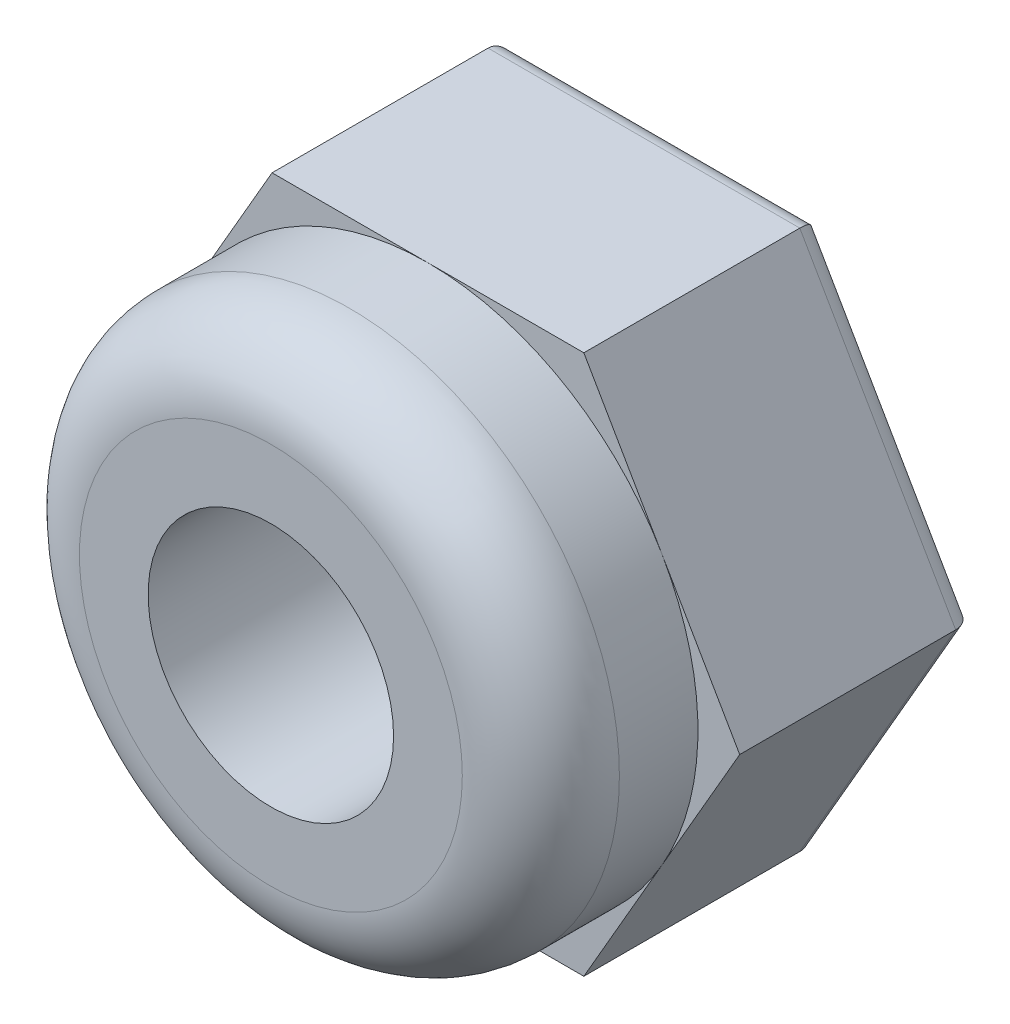
ISO-10303-21;
HEADER;
FILE_DESCRIPTION(('STEP AP214'),'2;1');
FILE_NAME('part.step','',(''),(''),'','','');
FILE_SCHEMA(('AUTOMOTIVE_DESIGN { 1 0 10303 214 1 1 1 1 }'));
ENDSEC;
DATA;
#1=APPLICATION_CONTEXT('core data for automotive mechanical design processes');
#2=APPLICATION_PROTOCOL_DEFINITION('international standard','automotive_design',2000,#1);
#3=PRODUCT_CONTEXT('',#1,'mechanical');
#4=PRODUCT('Part','Part','',(#3));
#5=PRODUCT_RELATED_PRODUCT_CATEGORY('part','',(#4));
#6=PRODUCT_DEFINITION_FORMATION('','',#4);
#7=PRODUCT_DEFINITION_CONTEXT('part definition',#1,'design');
#8=PRODUCT_DEFINITION('design','',#6,#7);
#9=PRODUCT_DEFINITION_SHAPE('','',#8);
#10=(LENGTH_UNIT() NAMED_UNIT(*) SI_UNIT(.MILLI.,.METRE.));
#11=(NAMED_UNIT(*) PLANE_ANGLE_UNIT() SI_UNIT($,.RADIAN.));
#12=(NAMED_UNIT(*) SI_UNIT($,.STERADIAN.) SOLID_ANGLE_UNIT());
#13=UNCERTAINTY_MEASURE_WITH_UNIT(LENGTH_MEASURE(1.E-05),#10,'distance_accuracy_value','');
#14=(GEOMETRIC_REPRESENTATION_CONTEXT(3) GLOBAL_UNCERTAINTY_ASSIGNED_CONTEXT((#13)) GLOBAL_UNIT_ASSIGNED_CONTEXT((#10,
#11,#12)) REPRESENTATION_CONTEXT('',''));
#15=CARTESIAN_POINT('',(0.,0.,0.));
#16=DIRECTION('',(0.,0.,1.));
#17=DIRECTION('',(1.,0.,0.));
#18=AXIS2_PLACEMENT_3D('',#15,#16,#17);
#19=CARTESIAN_POINT('',(0.,0.,2.4));
#20=DIRECTION('',(0.,0.,1.));
#21=DIRECTION('',(1.,0.,0.));
#22=AXIS2_PLACEMENT_3D('',#19,#20,#21);
#23=PLANE('',#22);
#24=CARTESIAN_POINT('',(0.,0.,2.4));
#25=DIRECTION('',(0.,0.,1.));
#26=DIRECTION('',(1.,0.,0.));
#27=AXIS2_PLACEMENT_3D('',#24,#25,#26);
#28=CIRCLE('',#27,2.75);
#29=CARTESIAN_POINT('',(2.38156986040721,1.375,2.4));
#30=VERTEX_POINT('',#29);
#31=CARTESIAN_POINT('',(0.,2.75,2.4));
#32=VERTEX_POINT('',#31);
#33=EDGE_CURVE('E184',#30,#32,#28,.T.);
#34=ORIENTED_EDGE('',*,*,#33,.F.);
#35=DIRECTION('',(-0.5,0.866025403784438,0.));
#36=VECTOR('',#35,1.);
#37=CARTESIAN_POINT('',(3.17542648054294,0.,2.4));
#38=LINE('',#37,#36);
#39=CARTESIAN_POINT('',(1.58771324027147,2.75,2.4));
#40=VERTEX_POINT('',#39);
#41=EDGE_CURVE('E170',#30,#40,#38,.T.);
#42=ORIENTED_EDGE('',*,*,#41,.T.);
#43=DIRECTION('',(-1.,0.,0.));
#44=VECTOR('',#43,1.);
#45=CARTESIAN_POINT('',(1.58771324027147,2.75,2.4));
#46=LINE('',#45,#44);
#47=EDGE_CURVE('E185',#40,#32,#46,.T.);
#48=ORIENTED_EDGE('',*,*,#47,.T.);
#49=EDGE_LOOP('',(#34,#42,#48));
#50=FACE_BOUND('',#49,.T.);
#51=ADVANCED_FACE('F42',(#50),#23,.T.);
#52=CARTESIAN_POINT('',(-2.38156986040721,1.375,2.4));
#53=VERTEX_POINT('',#52);
#54=EDGE_CURVE('E191',#32,#53,#28,.T.);
#55=ORIENTED_EDGE('',*,*,#54,.F.);
#56=CARTESIAN_POINT('',(-1.58771324027147,2.75,2.4));
#57=VERTEX_POINT('',#56);
#58=EDGE_CURVE('E169',#32,#57,#46,.T.);
#59=ORIENTED_EDGE('',*,*,#58,.T.);
#60=DIRECTION('',(-0.499999999999999,-0.866025403784439,0.));
#61=VECTOR('',#60,1.);
#62=CARTESIAN_POINT('',(-1.58771324027147,2.75,2.4));
#63=LINE('',#62,#61);
#64=EDGE_CURVE('E212',#57,#53,#63,.T.);
#65=ORIENTED_EDGE('',*,*,#64,.T.);
#66=EDGE_LOOP('',(#55,#59,#65));
#67=FACE_BOUND('',#66,.T.);
#68=ADVANCED_FACE('F322',(#67),#23,.T.);
#69=CARTESIAN_POINT('',(-2.38156986040721,-1.375,2.4));
#70=VERTEX_POINT('',#69);
#71=EDGE_CURVE('E353',#53,#70,#28,.T.);
#72=ORIENTED_EDGE('',*,*,#71,.F.);
#73=CARTESIAN_POINT('',(-3.17542648054294,0.,2.4));
#74=VERTEX_POINT('',#73);
#75=EDGE_CURVE('E211',#53,#74,#63,.T.);
#76=ORIENTED_EDGE('',*,*,#75,.T.);
#77=DIRECTION('',(0.5,-0.866025403784438,0.));
#78=VECTOR('',#77,1.);
#79=CARTESIAN_POINT('',(-3.17542648054294,0.,2.4));
#80=LINE('',#79,#78);
#81=EDGE_CURVE('E217',#74,#70,#80,.T.);
#82=ORIENTED_EDGE('',*,*,#81,.T.);
#83=EDGE_LOOP('',(#72,#76,#82));
#84=FACE_BOUND('',#83,.T.);
#85=ADVANCED_FACE('F327',(#84),#23,.T.);
#86=CARTESIAN_POINT('',(0.,-2.75,2.4));
#87=VERTEX_POINT('',#86);
#88=EDGE_CURVE('E201',#70,#87,#28,.T.);
#89=ORIENTED_EDGE('',*,*,#88,.F.);
#90=CARTESIAN_POINT('',(-1.58771324027147,-2.75,2.4));
#91=VERTEX_POINT('',#90);
#92=EDGE_CURVE('E216',#70,#91,#80,.T.);
#93=ORIENTED_EDGE('',*,*,#92,.T.);
#94=DIRECTION('',(1.,0.,0.));
#95=VECTOR('',#94,1.);
#96=CARTESIAN_POINT('',(-1.58771324027147,-2.75,2.4));
#97=LINE('',#96,#95);
#98=EDGE_CURVE('E222',#91,#87,#97,.T.);
#99=ORIENTED_EDGE('',*,*,#98,.T.);
#100=EDGE_LOOP('',(#89,#93,#99));
#101=FACE_BOUND('',#100,.T.);
#102=ADVANCED_FACE('F340',(#101),#23,.T.);
#103=CARTESIAN_POINT('',(2.38156986040721,-1.375,2.4));
#104=VERTEX_POINT('',#103);
#105=EDGE_CURVE('E195',#87,#104,#28,.T.);
#106=ORIENTED_EDGE('',*,*,#105,.F.);
#107=CARTESIAN_POINT('',(1.58771324027147,-2.75,2.4));
#108=VERTEX_POINT('',#107);
#109=EDGE_CURVE('E221',#87,#108,#97,.T.);
#110=ORIENTED_EDGE('',*,*,#109,.T.);
#111=DIRECTION('',(0.499999999999999,0.866025403784439,0.));
#112=VECTOR('',#111,1.);
#113=CARTESIAN_POINT('',(1.58771324027147,-2.75,2.4));
#114=LINE('',#113,#112);
#115=EDGE_CURVE('E182',#108,#104,#114,.T.);
#116=ORIENTED_EDGE('',*,*,#115,.T.);
#117=EDGE_LOOP('',(#106,#110,#116));
#118=FACE_BOUND('',#117,.T.);
#119=ADVANCED_FACE('F333',(#118),#23,.T.);
#120=EDGE_CURVE('E162',#104,#30,#28,.T.);
#121=ORIENTED_EDGE('',*,*,#120,.F.);
#122=CARTESIAN_POINT('',(3.17542648054294,0.,2.4));
#123=VERTEX_POINT('',#122);
#124=EDGE_CURVE('E164',#104,#123,#114,.T.);
#125=ORIENTED_EDGE('',*,*,#124,.T.);
#126=EDGE_CURVE('E158',#123,#30,#38,.T.);
#127=ORIENTED_EDGE('',*,*,#126,.T.);
#128=EDGE_LOOP('',(#121,#125,#127));
#129=FACE_BOUND('',#128,.T.);
#130=ADVANCED_FACE('F160',(#129),#23,.T.);
#131=CARTESIAN_POINT('',(0.,0.,0.));
#132=DIRECTION('',(0.,0.,1.));
#133=DIRECTION('',(1.,0.,0.));
#134=AXIS2_PLACEMENT_3D('',#131,#132,#133);
#135=PLANE('',#134);
#136=CARTESIAN_POINT('',(0.,0.,0.));
#137=DIRECTION('',(0.,0.,1.));
#138=DIRECTION('',(1.,0.,0.));
#139=AXIS2_PLACEMENT_3D('',#136,#137,#138);
#140=CIRCLE('',#139,1.45);
#141=CARTESIAN_POINT('',(1.45,0.,0.));
#142=VERTEX_POINT('',#141);
#143=EDGE_CURVE('E259',#142,#142,#140,.T.);
#144=ORIENTED_EDGE('',*,*,#143,.T.);
#145=EDGE_LOOP('',(#144));
#146=FACE_BOUND('',#145,.T.);
#147=DIRECTION('',(-1.,0.,0.));
#148=VECTOR('',#147,1.);
#149=CARTESIAN_POINT('',(0.,2.55,0.));
#150=LINE('',#149,#148);
#151=CARTESIAN_POINT('',(-1.47224318643355,2.55,0.));
#152=VERTEX_POINT('',#151);
#153=CARTESIAN_POINT('',(1.47224318643354,2.55,0.));
#154=VERTEX_POINT('',#153);
#155=EDGE_CURVE('E252',#152,#154,#150,.F.);
#156=ORIENTED_EDGE('',*,*,#155,.T.);
#157=DIRECTION('',(-0.5,0.866025403784439,0.));
#158=VECTOR('',#157,1.);
#159=CARTESIAN_POINT('',(2.20836477965032,1.275,0.));
#160=LINE('',#159,#158);
#161=CARTESIAN_POINT('',(2.94448637286709,0.,0.));
#162=VERTEX_POINT('',#161);
#163=EDGE_CURVE('E255',#154,#162,#160,.F.);
#164=ORIENTED_EDGE('',*,*,#163,.T.);
#165=DIRECTION('',(0.499999999999999,0.866025403784439,0.));
#166=VECTOR('',#165,1.);
#167=CARTESIAN_POINT('',(2.20836477965032,-1.275,0.));
#168=LINE('',#167,#166);
#169=CARTESIAN_POINT('',(1.47224318643355,-2.55,0.));
#170=VERTEX_POINT('',#169);
#171=EDGE_CURVE('E241',#162,#170,#168,.F.);
#172=ORIENTED_EDGE('',*,*,#171,.T.);
#173=DIRECTION('',(1.,0.,0.));
#174=VECTOR('',#173,1.);
#175=CARTESIAN_POINT('',(0.,-2.55,0.));
#176=LINE('',#175,#174);
#177=CARTESIAN_POINT('',(-1.47224318643354,-2.55,0.));
#178=VERTEX_POINT('',#177);
#179=EDGE_CURVE('E243',#170,#178,#176,.F.);
#180=ORIENTED_EDGE('',*,*,#179,.T.);
#181=DIRECTION('',(0.5,-0.866025403784439,0.));
#182=VECTOR('',#181,1.);
#183=CARTESIAN_POINT('',(-2.20836477965032,-1.275,0.));
#184=LINE('',#183,#182);
#185=CARTESIAN_POINT('',(-2.94448637286709,0.,0.));
#186=VERTEX_POINT('',#185);
#187=EDGE_CURVE('E246',#178,#186,#184,.F.);
#188=ORIENTED_EDGE('',*,*,#187,.T.);
#189=DIRECTION('',(-0.499999999999999,-0.866025403784439,0.));
#190=VECTOR('',#189,1.);
#191=CARTESIAN_POINT('',(-2.20836477965032,1.275,0.));
#192=LINE('',#191,#190);
#193=EDGE_CURVE('E249',#186,#152,#192,.F.);
#194=ORIENTED_EDGE('',*,*,#193,.T.);
#195=EDGE_LOOP('',(#156,#164,#172,#180,#188,#194));
#196=FACE_BOUND('',#195,.T.);
#197=ADVANCED_FACE('F332',(#146,#196),#135,.F.);
#198=CARTESIAN_POINT('',(1.58771324027147,-2.75,2.4));
#199=DIRECTION('',(-0.866025403784439,0.499999999999999,0.));
#200=DIRECTION('',(-0.499999999999999,-0.866025403784439,0.));
#201=AXIS2_PLACEMENT_3D('',#198,#199,#200);
#202=PLANE('',#201);
#203=DIRECTION('',(0.,0.,-1.));
#204=VECTOR('',#203,1.);
#205=CARTESIAN_POINT('',(1.58771324027147,-2.75,2.4));
#206=LINE('',#205,#204);
#207=CARTESIAN_POINT('',(1.58771324027147,-2.75,0.2));
#208=VERTEX_POINT('',#207);
#209=EDGE_CURVE('E226',#108,#208,#206,.T.);
#210=ORIENTED_EDGE('',*,*,#209,.T.);
#211=DIRECTION('',(0.499999999999999,0.866025403784439,0.));
#212=VECTOR('',#211,1.);
#213=CARTESIAN_POINT('',(1.58771324027147,-2.75,0.2));
#214=LINE('',#213,#212);
#215=CARTESIAN_POINT('',(3.17542648054294,0.,0.2));
#216=VERTEX_POINT('',#215);
#217=EDGE_CURVE('E280',#208,#216,#214,.T.);
#218=ORIENTED_EDGE('',*,*,#217,.T.);
#219=DIRECTION('',(0.,0.,-1.));
#220=VECTOR('',#219,1.);
#221=CARTESIAN_POINT('',(3.17542648054294,0.,2.4));
#222=LINE('',#221,#220);
#223=EDGE_CURVE('E197',#123,#216,#222,.T.);
#224=ORIENTED_EDGE('',*,*,#223,.F.);
#225=ORIENTED_EDGE('',*,*,#124,.F.);
#226=ORIENTED_EDGE('',*,*,#115,.F.);
#227=EDGE_LOOP('',(#210,#218,#224,#225,#226));
#228=FACE_BOUND('',#227,.T.);
#229=ADVANCED_FACE('F338',(#228),#202,.F.);
#230=CARTESIAN_POINT('',(3.17542648054294,0.,2.4));
#231=DIRECTION('',(-0.866025403784438,-0.5,0.));
#232=DIRECTION('',(0.5,-0.866025403784439,0.));
#233=AXIS2_PLACEMENT_3D('',#230,#231,#232);
#234=PLANE('',#233);
#235=ORIENTED_EDGE('',*,*,#223,.T.);
#236=DIRECTION('',(-0.5,0.866025403784439,0.));
#237=VECTOR('',#236,1.);
#238=CARTESIAN_POINT('',(3.17542648054294,0.,0.2));
#239=LINE('',#238,#237);
#240=CARTESIAN_POINT('',(1.58771324027147,2.75,0.2));
#241=VERTEX_POINT('',#240);
#242=EDGE_CURVE('E267',#216,#241,#239,.T.);
#243=ORIENTED_EDGE('',*,*,#242,.T.);
#244=DIRECTION('',(0.,0.,-1.));
#245=VECTOR('',#244,1.);
#246=CARTESIAN_POINT('',(1.58771324027147,2.75,2.4));
#247=LINE('',#246,#245);
#248=EDGE_CURVE('E177',#40,#241,#247,.T.);
#249=ORIENTED_EDGE('',*,*,#248,.F.);
#250=ORIENTED_EDGE('',*,*,#41,.F.);
#251=ORIENTED_EDGE('',*,*,#126,.F.);
#252=EDGE_LOOP('',(#235,#243,#249,#250,#251));
#253=FACE_BOUND('',#252,.T.);
#254=ADVANCED_FACE('F174',(#253),#234,.F.);
#255=CARTESIAN_POINT('',(1.58771324027147,2.75,2.4));
#256=DIRECTION('',(0.,-1.,0.));
#257=DIRECTION('',(1.,0.,0.));
#258=AXIS2_PLACEMENT_3D('',#255,#256,#257);
#259=PLANE('',#258);
#260=ORIENTED_EDGE('',*,*,#248,.T.);
#261=DIRECTION('',(-1.,0.,0.));
#262=VECTOR('',#261,1.);
#263=CARTESIAN_POINT('',(1.58771324027147,2.75,0.2));
#264=LINE('',#263,#262);
#265=CARTESIAN_POINT('',(-1.58771324027147,2.75,0.2));
#266=VERTEX_POINT('',#265);
#267=EDGE_CURVE('E270',#241,#266,#264,.T.);
#268=ORIENTED_EDGE('',*,*,#267,.T.);
#269=DIRECTION('',(0.,0.,-1.));
#270=VECTOR('',#269,1.);
#271=CARTESIAN_POINT('',(-1.58771324027147,2.75,2.4));
#272=LINE('',#271,#270);
#273=EDGE_CURVE('E235',#57,#266,#272,.T.);
#274=ORIENTED_EDGE('',*,*,#273,.F.);
#275=ORIENTED_EDGE('',*,*,#58,.F.);
#276=ORIENTED_EDGE('',*,*,#47,.F.);
#277=EDGE_LOOP('',(#260,#268,#274,#275,#276));
#278=FACE_BOUND('',#277,.T.);
#279=ADVANCED_FACE('F363',(#278),#259,.F.);
#280=CARTESIAN_POINT('',(-1.58771324027147,2.75,2.4));
#281=DIRECTION('',(0.866025403784439,-0.499999999999999,0.));
#282=DIRECTION('',(0.499999999999999,0.866025403784439,0.));
#283=AXIS2_PLACEMENT_3D('',#280,#281,#282);
#284=PLANE('',#283);
#285=ORIENTED_EDGE('',*,*,#273,.T.);
#286=DIRECTION('',(-0.499999999999999,-0.866025403784439,0.));
#287=VECTOR('',#286,1.);
#288=CARTESIAN_POINT('',(-1.58771324027147,2.75,0.2));
#289=LINE('',#288,#287);
#290=CARTESIAN_POINT('',(-3.17542648054294,0.,0.2));
#291=VERTEX_POINT('',#290);
#292=EDGE_CURVE('E273',#266,#291,#289,.T.);
#293=ORIENTED_EDGE('',*,*,#292,.T.);
#294=DIRECTION('',(0.,0.,-1.));
#295=VECTOR('',#294,1.);
#296=CARTESIAN_POINT('',(-3.17542648054294,0.,2.4));
#297=LINE('',#296,#295);
#298=EDGE_CURVE('E232',#74,#291,#297,.T.);
#299=ORIENTED_EDGE('',*,*,#298,.F.);
#300=ORIENTED_EDGE('',*,*,#75,.F.);
#301=ORIENTED_EDGE('',*,*,#64,.F.);
#302=EDGE_LOOP('',(#285,#293,#299,#300,#301));
#303=FACE_BOUND('',#302,.T.);
#304=ADVANCED_FACE('F368',(#303),#284,.F.);
#305=CARTESIAN_POINT('',(-3.17542648054294,0.,2.4));
#306=DIRECTION('',(0.866025403784438,0.5,0.));
#307=DIRECTION('',(-0.5,0.866025403784439,0.));
#308=AXIS2_PLACEMENT_3D('',#305,#306,#307);
#309=PLANE('',#308);
#310=ORIENTED_EDGE('',*,*,#298,.T.);
#311=DIRECTION('',(0.5,-0.866025403784439,0.));
#312=VECTOR('',#311,1.);
#313=CARTESIAN_POINT('',(-3.17542648054294,0.,0.2));
#314=LINE('',#313,#312);
#315=CARTESIAN_POINT('',(-1.58771324027147,-2.75,0.2));
#316=VERTEX_POINT('',#315);
#317=EDGE_CURVE('E71',#291,#316,#314,.T.);
#318=ORIENTED_EDGE('',*,*,#317,.T.);
#319=DIRECTION('',(0.,0.,-1.));
#320=VECTOR('',#319,1.);
#321=CARTESIAN_POINT('',(-1.58771324027147,-2.75,2.4));
#322=LINE('',#321,#320);
#323=EDGE_CURVE('E229',#91,#316,#322,.T.);
#324=ORIENTED_EDGE('',*,*,#323,.F.);
#325=ORIENTED_EDGE('',*,*,#92,.F.);
#326=ORIENTED_EDGE('',*,*,#81,.F.);
#327=EDGE_LOOP('',(#310,#318,#324,#325,#326));
#328=FACE_BOUND('',#327,.T.);
#329=ADVANCED_FACE('F372',(#328),#309,.F.);
#330=CARTESIAN_POINT('',(-1.58771324027147,-2.75,2.4));
#331=DIRECTION('',(0.,1.,0.));
#332=DIRECTION('',(-1.,0.,0.));
#333=AXIS2_PLACEMENT_3D('',#330,#331,#332);
#334=PLANE('',#333);
#335=ORIENTED_EDGE('',*,*,#323,.T.);
#336=DIRECTION('',(1.,0.,0.));
#337=VECTOR('',#336,1.);
#338=CARTESIAN_POINT('',(-1.58771324027147,-2.75,0.2));
#339=LINE('',#338,#337);
#340=EDGE_CURVE('E61',#316,#208,#339,.T.);
#341=ORIENTED_EDGE('',*,*,#340,.T.);
#342=ORIENTED_EDGE('',*,*,#209,.F.);
#343=ORIENTED_EDGE('',*,*,#109,.F.);
#344=ORIENTED_EDGE('',*,*,#98,.F.);
#345=EDGE_LOOP('',(#335,#341,#342,#343,#344));
#346=FACE_BOUND('',#345,.T.);
#347=ADVANCED_FACE('F349',(#346),#334,.F.);
#348=CARTESIAN_POINT('',(0.,0.,2.4));
#349=DIRECTION('',(0.,0.,-1.));
#350=DIRECTION('',(-1.,0.,0.));
#351=AXIS2_PLACEMENT_3D('',#348,#349,#350);
#352=CYLINDRICAL_SURFACE('',#351,1.25);
#353=CARTESIAN_POINT('',(0.,0.,0.2));
#354=DIRECTION('',(0.,0.,1.));
#355=DIRECTION('',(1.,0.,0.));
#356=AXIS2_PLACEMENT_3D('',#353,#354,#355);
#357=CIRCLE('',#356,1.25);
#358=CARTESIAN_POINT('',(1.25,0.,0.2));
#359=VERTEX_POINT('',#358);
#360=EDGE_CURVE('E263',#359,#359,#357,.F.);
#361=ORIENTED_EDGE('',*,*,#360,.T.);
#362=EDGE_LOOP('',(#361));
#363=FACE_BOUND('',#362,.T.);
#364=CARTESIAN_POINT('',(0.,0.,4.));
#365=DIRECTION('',(0.,0.,1.));
#366=DIRECTION('',(1.,0.,0.));
#367=AXIS2_PLACEMENT_3D('',#364,#365,#366);
#368=CIRCLE('',#367,1.25);
#369=CARTESIAN_POINT('',(1.25,0.,4.));
#370=VERTEX_POINT('',#369);
#371=EDGE_CURVE('E189',#370,#370,#368,.T.);
#372=ORIENTED_EDGE('',*,*,#371,.T.);
#373=EDGE_LOOP('',(#372));
#374=FACE_BOUND('',#373,.T.);
#375=ADVANCED_FACE('F443',(#363,#374),#352,.F.);
#376=CARTESIAN_POINT('',(0.,0.,4.));
#377=DIRECTION('',(0.,0.,1.));
#378=DIRECTION('',(1.,0.,0.));
#379=AXIS2_PLACEMENT_3D('',#376,#377,#378);
#380=PLANE('',#379);
#381=CARTESIAN_POINT('',(0.,0.,4.));
#382=DIRECTION('',(0.,0.,1.));
#383=DIRECTION('',(1.,0.,0.));
#384=AXIS2_PLACEMENT_3D('',#381,#382,#383);
#385=CIRCLE('',#384,1.95);
#386=CARTESIAN_POINT('',(1.95,0.,4.));
#387=VERTEX_POINT('',#386);
#388=EDGE_CURVE('E51',#387,#387,#385,.T.);
#389=ORIENTED_EDGE('',*,*,#388,.T.);
#390=EDGE_LOOP('',(#389));
#391=FACE_BOUND('',#390,.T.);
#392=ORIENTED_EDGE('',*,*,#371,.F.);
#393=EDGE_LOOP('',(#392));
#394=FACE_BOUND('',#393,.T.);
#395=ADVANCED_FACE('F308',(#391,#394),#380,.T.);
#396=CARTESIAN_POINT('',(0.,0.,4.));
#397=DIRECTION('',(0.,0.,-1.));
#398=DIRECTION('',(-1.,0.,0.));
#399=AXIS2_PLACEMENT_3D('',#396,#397,#398);
#400=CYLINDRICAL_SURFACE('',#399,2.75);
#401=CARTESIAN_POINT('',(0.,0.,3.2));
#402=DIRECTION('',(0.,0.,1.));
#403=DIRECTION('',(1.,0.,0.));
#404=AXIS2_PLACEMENT_3D('',#401,#402,#403);
#405=CIRCLE('',#404,2.75);
#406=CARTESIAN_POINT('',(2.75,0.,3.2));
#407=VERTEX_POINT('',#406);
#408=EDGE_CURVE('E11',#407,#407,#405,.F.);
#409=ORIENTED_EDGE('',*,*,#408,.T.);
#410=EDGE_LOOP('',(#409));
#411=FACE_BOUND('',#410,.T.);
#412=ORIENTED_EDGE('',*,*,#33,.T.);
#413=ORIENTED_EDGE('',*,*,#54,.T.);
#414=ORIENTED_EDGE('',*,*,#71,.T.);
#415=ORIENTED_EDGE('',*,*,#88,.T.);
#416=ORIENTED_EDGE('',*,*,#105,.T.);
#417=ORIENTED_EDGE('',*,*,#120,.T.);
#418=EDGE_LOOP('',(#412,#413,#414,#415,#416,#417));
#419=FACE_BOUND('',#418,.T.);
#420=ADVANCED_FACE('F193',(#411,#419),#400,.T.);
#421=CARTESIAN_POINT('',(0.,0.,0.2));
#422=DIRECTION('',(0.,0.,1.));
#423=DIRECTION('',(1.,0.,0.));
#424=AXIS2_PLACEMENT_3D('',#421,#422,#423);
#425=TOROIDAL_SURFACE('',#424,1.45,0.2);
#426=ORIENTED_EDGE('',*,*,#360,.F.);
#427=EDGE_LOOP('',(#426));
#428=FACE_BOUND('',#427,.T.);
#429=ORIENTED_EDGE('',*,*,#143,.F.);
#430=EDGE_LOOP('',(#429));
#431=FACE_BOUND('',#430,.T.);
#432=ADVANCED_FACE('F409',(#428,#431),#425,.T.);
#433=CARTESIAN_POINT('',(-3.00222139978605,0.0999999999999979,0.2));
#434=DIRECTION('',(0.5,-0.866025403784439,0.));
#435=DIRECTION('',(0.866025403784438,0.5,0.));
#436=AXIS2_PLACEMENT_3D('',#433,#434,#435);
#437=CYLINDRICAL_SURFACE('',#436,0.2);
#438=CARTESIAN_POINT('',(-2.94448637286709,0.,0.2));
#439=DIRECTION('',(0.,-1.,0.));
#440=DIRECTION('',(1.,0.,0.));
#441=AXIS2_PLACEMENT_3D('',#438,#439,#440);
#442=ELLIPSE('',#441,0.23094010767585,0.2);
#443=EDGE_CURVE('E297',#186,#291,#442,.F.);
#444=ORIENTED_EDGE('',*,*,#443,.F.);
#445=ORIENTED_EDGE('',*,*,#187,.F.);
#446=CARTESIAN_POINT('',(-1.47224318643354,-2.55,0.2));
#447=DIRECTION('',(0.866025403784439,-0.5,0.));
#448=DIRECTION('',(0.5,0.866025403784439,0.));
#449=AXIS2_PLACEMENT_3D('',#446,#447,#448);
#450=ELLIPSE('',#449,0.23094010767585,0.2);
#451=EDGE_CURVE('E301',#316,#178,#450,.T.);
#452=ORIENTED_EDGE('',*,*,#451,.F.);
#453=ORIENTED_EDGE('',*,*,#317,.F.);
#454=EDGE_LOOP('',(#444,#445,#452,#453));
#455=FACE_BOUND('',#454,.T.);
#456=ADVANCED_FACE('F378',(#455),#437,.T.);
#457=CARTESIAN_POINT('',(-1.58771324027147,-2.55,0.2));
#458=DIRECTION('',(1.,0.,0.));
#459=DIRECTION('',(0.,1.,0.));
#460=AXIS2_PLACEMENT_3D('',#457,#458,#459);
#461=CYLINDRICAL_SURFACE('',#460,0.2);
#462=ORIENTED_EDGE('',*,*,#451,.T.);
#463=ORIENTED_EDGE('',*,*,#179,.F.);
#464=CARTESIAN_POINT('',(1.47224318643355,-2.55,0.2));
#465=DIRECTION('',(0.866025403784438,0.5,0.));
#466=DIRECTION('',(-0.5,0.866025403784439,0.));
#467=AXIS2_PLACEMENT_3D('',#464,#465,#466);
#468=ELLIPSE('',#467,0.23094010767585,0.2);
#469=EDGE_CURVE('E293',#208,#170,#468,.T.);
#470=ORIENTED_EDGE('',*,*,#469,.F.);
#471=ORIENTED_EDGE('',*,*,#340,.F.);
#472=EDGE_LOOP('',(#462,#463,#470,#471));
#473=FACE_BOUND('',#472,.T.);
#474=ADVANCED_FACE('F382',(#473),#461,.T.);
#475=CARTESIAN_POINT('',(-1.41450815951458,2.65,0.2));
#476=DIRECTION('',(-0.499999999999999,-0.866025403784439,0.));
#477=DIRECTION('',(0.866025403784439,-0.499999999999999,0.));
#478=AXIS2_PLACEMENT_3D('',#475,#476,#477);
#479=CYLINDRICAL_SURFACE('',#478,0.2);
#480=ORIENTED_EDGE('',*,*,#443,.T.);
#481=ORIENTED_EDGE('',*,*,#292,.F.);
#482=CARTESIAN_POINT('',(-1.47224318643355,2.55,0.2));
#483=DIRECTION('',(-0.866025403784438,-0.5,0.));
#484=DIRECTION('',(0.5,-0.866025403784438,0.));
#485=AXIS2_PLACEMENT_3D('',#482,#483,#484);
#486=ELLIPSE('',#485,0.23094010767585,0.2);
#487=EDGE_CURVE('E289',#152,#266,#486,.F.);
#488=ORIENTED_EDGE('',*,*,#487,.F.);
#489=ORIENTED_EDGE('',*,*,#193,.F.);
#490=EDGE_LOOP('',(#480,#481,#488,#489));
#491=FACE_BOUND('',#490,.T.);
#492=ADVANCED_FACE('F397',(#491),#479,.T.);
#493=CARTESIAN_POINT('',(1.41450815951458,-2.65,0.2));
#494=DIRECTION('',(0.499999999999999,0.866025403784439,0.));
#495=DIRECTION('',(-0.866025403784439,0.499999999999999,0.));
#496=AXIS2_PLACEMENT_3D('',#493,#494,#495);
#497=CYLINDRICAL_SURFACE('',#496,0.2);
#498=ORIENTED_EDGE('',*,*,#469,.T.);
#499=ORIENTED_EDGE('',*,*,#171,.F.);
#500=CARTESIAN_POINT('',(2.94448637286709,0.,0.2));
#501=DIRECTION('',(0.,1.,0.));
#502=DIRECTION('',(1.,0.,0.));
#503=AXIS2_PLACEMENT_3D('',#500,#501,#502);
#504=ELLIPSE('',#503,0.23094010767585,0.2);
#505=EDGE_CURVE('E286',#216,#162,#504,.T.);
#506=ORIENTED_EDGE('',*,*,#505,.F.);
#507=ORIENTED_EDGE('',*,*,#217,.F.);
#508=EDGE_LOOP('',(#498,#499,#506,#507));
#509=FACE_BOUND('',#508,.T.);
#510=ADVANCED_FACE('F387',(#509),#497,.T.);
#511=CARTESIAN_POINT('',(1.58771324027147,2.55,0.2));
#512=DIRECTION('',(-1.,0.,0.));
#513=DIRECTION('',(0.,-1.,0.));
#514=AXIS2_PLACEMENT_3D('',#511,#512,#513);
#515=CYLINDRICAL_SURFACE('',#514,0.2);
#516=ORIENTED_EDGE('',*,*,#487,.T.);
#517=ORIENTED_EDGE('',*,*,#267,.F.);
#518=CARTESIAN_POINT('',(1.47224318643354,2.55,0.2));
#519=DIRECTION('',(-0.866025403784439,0.5,0.));
#520=DIRECTION('',(-0.5,-0.866025403784439,0.));
#521=AXIS2_PLACEMENT_3D('',#518,#519,#520);
#522=ELLIPSE('',#521,0.23094010767585,0.2);
#523=EDGE_CURVE('E283',#154,#241,#522,.F.);
#524=ORIENTED_EDGE('',*,*,#523,.F.);
#525=ORIENTED_EDGE('',*,*,#155,.F.);
#526=EDGE_LOOP('',(#516,#517,#524,#525));
#527=FACE_BOUND('',#526,.T.);
#528=ADVANCED_FACE('F317',(#527),#515,.T.);
#529=CARTESIAN_POINT('',(3.00222139978605,-0.0999999999999979,0.2));
#530=DIRECTION('',(-0.5,0.866025403784439,0.));
#531=DIRECTION('',(-0.866025403784438,-0.5,0.));
#532=AXIS2_PLACEMENT_3D('',#529,#530,#531);
#533=CYLINDRICAL_SURFACE('',#532,0.2);
#534=ORIENTED_EDGE('',*,*,#505,.T.);
#535=ORIENTED_EDGE('',*,*,#163,.F.);
#536=ORIENTED_EDGE('',*,*,#523,.T.);
#537=ORIENTED_EDGE('',*,*,#242,.F.);
#538=EDGE_LOOP('',(#534,#535,#536,#537));
#539=FACE_BOUND('',#538,.T.);
#540=ADVANCED_FACE('F312',(#539),#533,.T.);
#541=CARTESIAN_POINT('',(0.,0.,3.2));
#542=DIRECTION('',(0.,0.,1.));
#543=DIRECTION('',(1.,0.,0.));
#544=AXIS2_PLACEMENT_3D('',#541,#542,#543);
#545=TOROIDAL_SURFACE('',#544,1.95,0.8);
#546=ORIENTED_EDGE('',*,*,#408,.F.);
#547=EDGE_LOOP('',(#546));
#548=FACE_BOUND('',#547,.T.);
#549=ORIENTED_EDGE('',*,*,#388,.F.);
#550=EDGE_LOOP('',(#549));
#551=FACE_BOUND('',#550,.T.);
#552=ADVANCED_FACE('F44',(#548,#551),#545,.T.);
#553=CLOSED_SHELL('',(#51,#68,#85,#102,#119,#130,#197,#229,#254,#279,#304,#329,#347,#375,#395,
#420,#432,#456,#474,#492,#510,#528,#540,#552));
#554=MANIFOLD_SOLID_BREP('B2',#553);
#555=ADVANCED_BREP_SHAPE_REPRESENTATION('',(#18,#554),#14);
#556=SHAPE_DEFINITION_REPRESENTATION(#9,#555);
ENDSEC;
END-ISO-10303-21;
